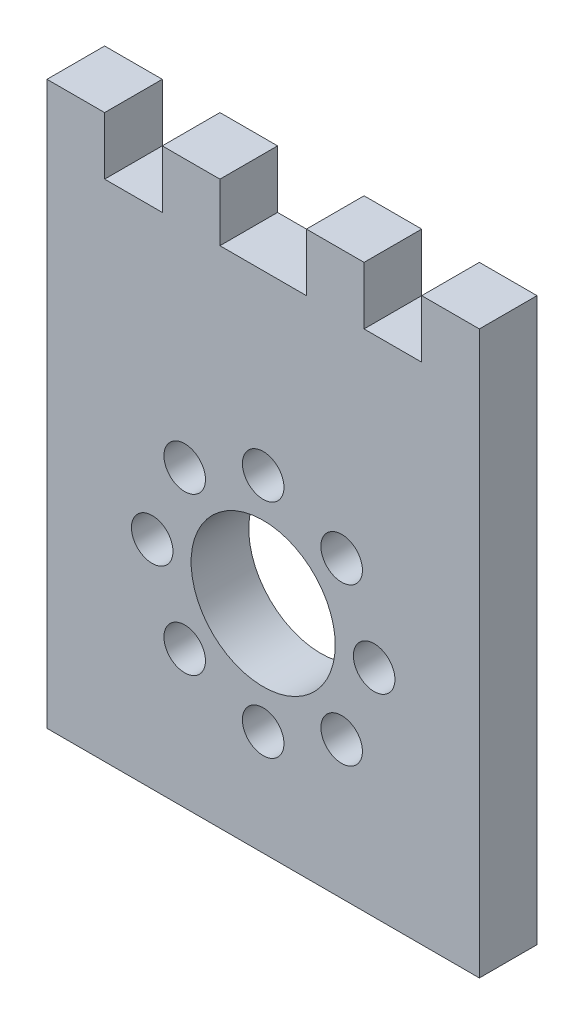
ISO-10303-21;
HEADER;
FILE_DESCRIPTION(('STEP AP214'),'2;1');
FILE_NAME('part.step','',(''),(''),'','','');
FILE_SCHEMA(('AUTOMOTIVE_DESIGN { 1 0 10303 214 1 1 1 1 }'));
ENDSEC;
DATA;
#1=APPLICATION_CONTEXT('core data for automotive mechanical design processes');
#2=APPLICATION_PROTOCOL_DEFINITION('international standard','automotive_design',2000,#1);
#3=PRODUCT_CONTEXT('',#1,'mechanical');
#4=PRODUCT('Part','Part','',(#3));
#5=PRODUCT_RELATED_PRODUCT_CATEGORY('part','',(#4));
#6=PRODUCT_DEFINITION_FORMATION('','',#4);
#7=PRODUCT_DEFINITION_CONTEXT('part definition',#1,'design');
#8=PRODUCT_DEFINITION('design','',#6,#7);
#9=PRODUCT_DEFINITION_SHAPE('','',#8);
#10=(LENGTH_UNIT() NAMED_UNIT(*) SI_UNIT(.MILLI.,.METRE.));
#11=(NAMED_UNIT(*) PLANE_ANGLE_UNIT() SI_UNIT($,.RADIAN.));
#12=(NAMED_UNIT(*) SI_UNIT($,.STERADIAN.) SOLID_ANGLE_UNIT());
#13=UNCERTAINTY_MEASURE_WITH_UNIT(LENGTH_MEASURE(1.E-05),#10,'distance_accuracy_value','');
#14=(GEOMETRIC_REPRESENTATION_CONTEXT(3) GLOBAL_UNCERTAINTY_ASSIGNED_CONTEXT((#13)) GLOBAL_UNIT_ASSIGNED_CONTEXT((#10,
#11,#12)) REPRESENTATION_CONTEXT('',''));
#15=CARTESIAN_POINT('',(0.,0.,0.));
#16=DIRECTION('',(0.,0.,1.));
#17=DIRECTION('',(1.,0.,0.));
#18=AXIS2_PLACEMENT_3D('',#15,#16,#17);
#19=CARTESIAN_POINT('',(-16.5553571428571,15.7616071428571,5.08));
#20=DIRECTION('',(1.,0.,0.));
#21=DIRECTION('',(0.,1.,0.));
#22=AXIS2_PLACEMENT_3D('',#19,#20,#21);
#23=PLANE('',#22);
#24=DIRECTION('',(0.,0.,-1.));
#25=VECTOR('',#24,1.);
#26=CARTESIAN_POINT('',(-16.5553571428571,-28.6883928571429,5.08));
#27=LINE('',#26,#25);
#28=CARTESIAN_POINT('',(-16.5553571428571,-28.6883928571429,5.08));
#29=VERTEX_POINT('',#28);
#30=CARTESIAN_POINT('',(-16.5553571428571,-28.6883928571429,0.));
#31=VERTEX_POINT('',#30);
#32=EDGE_CURVE('E50',#29,#31,#27,.T.);
#33=ORIENTED_EDGE('',*,*,#32,.F.);
#34=DIRECTION('',(0.,-1.,0.));
#35=VECTOR('',#34,1.);
#36=CARTESIAN_POINT('',(-16.5553571428571,15.7616071428571,5.08));
#37=LINE('',#36,#35);
#38=CARTESIAN_POINT('',(-16.5553571428571,20.8416071428572,5.08));
#39=VERTEX_POINT('',#38);
#40=EDGE_CURVE('E174',#39,#29,#37,.T.);
#41=ORIENTED_EDGE('',*,*,#40,.F.);
#42=DIRECTION('',(0.,0.,1.));
#43=VECTOR('',#42,1.);
#44=CARTESIAN_POINT('',(-16.5553571428571,20.8416071428572,0.));
#45=LINE('',#44,#43);
#46=CARTESIAN_POINT('',(-16.5553571428571,20.8416071428572,0.));
#47=VERTEX_POINT('',#46);
#48=EDGE_CURVE('E270',#47,#39,#45,.T.);
#49=ORIENTED_EDGE('',*,*,#48,.F.);
#50=DIRECTION('',(0.,-1.,0.));
#51=VECTOR('',#50,1.);
#52=CARTESIAN_POINT('',(-16.5553571428571,15.7616071428571,0.));
#53=LINE('',#52,#51);
#54=EDGE_CURVE('E168',#47,#31,#53,.T.);
#55=ORIENTED_EDGE('',*,*,#54,.T.);
#56=EDGE_LOOP('',(#33,#41,#49,#55));
#57=FACE_BOUND('',#56,.T.);
#58=ADVANCED_FACE('F33',(#57),#23,.F.);
#59=CARTESIAN_POINT('',(21.5446428571429,15.7616071428571,5.08));
#60=DIRECTION('',(-1.,0.,0.));
#61=DIRECTION('',(0.,0.,1.));
#62=AXIS2_PLACEMENT_3D('',#59,#60,#61);
#63=PLANE('',#62);
#64=DIRECTION('',(0.,0.,1.));
#65=VECTOR('',#64,1.);
#66=CARTESIAN_POINT('',(21.5446428571429,-28.6883928571429,5.08));
#67=LINE('',#66,#65);
#68=CARTESIAN_POINT('',(21.5446428571429,-28.6883928571429,0.));
#69=VERTEX_POINT('',#68);
#70=CARTESIAN_POINT('',(21.5446428571429,-28.6883928571429,5.08));
#71=VERTEX_POINT('',#70);
#72=EDGE_CURVE('E147',#69,#71,#67,.T.);
#73=ORIENTED_EDGE('',*,*,#72,.F.);
#74=DIRECTION('',(0.,1.,0.));
#75=VECTOR('',#74,1.);
#76=CARTESIAN_POINT('',(21.5446428571429,15.7616071428571,0.));
#77=LINE('',#76,#75);
#78=CARTESIAN_POINT('',(21.5446428571429,20.8416071428572,0.));
#79=VERTEX_POINT('',#78);
#80=EDGE_CURVE('E157',#69,#79,#77,.T.);
#81=ORIENTED_EDGE('',*,*,#80,.T.);
#82=DIRECTION('',(0.,0.,1.));
#83=VECTOR('',#82,1.);
#84=CARTESIAN_POINT('',(21.5446428571429,20.8416071428572,0.));
#85=LINE('',#84,#83);
#86=CARTESIAN_POINT('',(21.5446428571429,20.8416071428572,5.08));
#87=VERTEX_POINT('',#86);
#88=EDGE_CURVE('E260',#79,#87,#85,.T.);
#89=ORIENTED_EDGE('',*,*,#88,.T.);
#90=DIRECTION('',(0.,1.,0.));
#91=VECTOR('',#90,1.);
#92=CARTESIAN_POINT('',(21.5446428571429,15.7616071428571,5.08));
#93=LINE('',#92,#91);
#94=EDGE_CURVE('E159',#71,#87,#93,.T.);
#95=ORIENTED_EDGE('',*,*,#94,.F.);
#96=EDGE_LOOP('',(#73,#81,#89,#95));
#97=FACE_BOUND('',#96,.T.);
#98=ADVANCED_FACE('F155',(#97),#63,.F.);
#99=CARTESIAN_POINT('',(0.,0.,5.08));
#100=DIRECTION('',(0.,0.,1.));
#101=DIRECTION('',(1.,0.,0.));
#102=AXIS2_PLACEMENT_3D('',#99,#100,#101);
#103=PLANE('',#102);
#104=CARTESIAN_POINT('',(9.4094400703662,-2.72359564391969,5.08));
#105=DIRECTION('',(0.,0.,1.));
#106=DIRECTION('',(1.,0.,0.));
#107=AXIS2_PLACEMENT_3D('',#104,#105,#106);
#108=CIRCLE('',#107,1.8288);
#109=CARTESIAN_POINT('',(11.2382400703662,-2.72359564391969,5.08));
#110=VERTEX_POINT('',#109);
#111=EDGE_CURVE('E207',#110,#110,#108,.T.);
#112=ORIENTED_EDGE('',*,*,#111,.F.);
#113=EDGE_LOOP('',(#112));
#114=FACE_BOUND('',#113,.T.);
#115=CARTESIAN_POINT('',(2.49464285714297,0.140607142857147,5.08));
#116=DIRECTION('',(0.,0.,1.));
#117=DIRECTION('',(1.,0.,0.));
#118=AXIS2_PLACEMENT_3D('',#115,#116,#117);
#119=CIRCLE('',#118,1.8288);
#120=CARTESIAN_POINT('',(4.32344285714297,0.140607142857147,5.08));
#121=VERTEX_POINT('',#120);
#122=EDGE_CURVE('E214',#121,#121,#119,.T.);
#123=ORIENTED_EDGE('',*,*,#122,.F.);
#124=EDGE_LOOP('',(#123));
#125=FACE_BOUND('',#124,.T.);
#126=CARTESIAN_POINT('',(-4.42015435608032,-2.72359564391954,5.08));
#127=DIRECTION('',(0.,0.,1.));
#128=DIRECTION('',(1.,0.,0.));
#129=AXIS2_PLACEMENT_3D('',#126,#127,#128);
#130=CIRCLE('',#129,1.8288);
#131=CARTESIAN_POINT('',(-2.59135435608032,-2.72359564391954,5.08));
#132=VERTEX_POINT('',#131);
#133=EDGE_CURVE('E220',#132,#132,#130,.T.);
#134=ORIENTED_EDGE('',*,*,#133,.F.);
#135=EDGE_LOOP('',(#134));
#136=FACE_BOUND('',#135,.T.);
#137=CARTESIAN_POINT('',(-7.28435714285713,-9.63839285714278,5.08));
#138=DIRECTION('',(0.,0.,1.));
#139=DIRECTION('',(1.,0.,0.));
#140=AXIS2_PLACEMENT_3D('',#137,#138,#139);
#141=CIRCLE('',#140,1.8288);
#142=CARTESIAN_POINT('',(-5.45555714285713,-9.63839285714278,5.08));
#143=VERTEX_POINT('',#142);
#144=EDGE_CURVE('E226',#143,#143,#141,.T.);
#145=ORIENTED_EDGE('',*,*,#144,.F.);
#146=EDGE_LOOP('',(#145));
#147=FACE_BOUND('',#146,.T.);
#148=CARTESIAN_POINT('',(-4.42015435608041,-16.5531900703661,5.08));
#149=DIRECTION('',(0.,0.,1.));
#150=DIRECTION('',(1.,0.,0.));
#151=AXIS2_PLACEMENT_3D('',#148,#149,#150);
#152=CIRCLE('',#151,1.8288);
#153=CARTESIAN_POINT('',(-2.59135435608041,-16.5531900703661,5.08));
#154=VERTEX_POINT('',#153);
#155=EDGE_CURVE('E183',#154,#154,#152,.T.);
#156=ORIENTED_EDGE('',*,*,#155,.F.);
#157=EDGE_LOOP('',(#156));
#158=FACE_BOUND('',#157,.T.);
#159=CARTESIAN_POINT('',(2.49464285714284,-19.4173928571428,5.08));
#160=DIRECTION('',(0.,0.,1.));
#161=DIRECTION('',(1.,0.,0.));
#162=AXIS2_PLACEMENT_3D('',#159,#160,#161);
#163=CIRCLE('',#162,1.8288);
#164=CARTESIAN_POINT('',(4.32344285714284,-19.4173928571428,5.08));
#165=VERTEX_POINT('',#164);
#166=EDGE_CURVE('E190',#165,#165,#163,.T.);
#167=ORIENTED_EDGE('',*,*,#166,.F.);
#168=EDGE_LOOP('',(#167));
#169=FACE_BOUND('',#168,.T.);
#170=CARTESIAN_POINT('',(9.40944007036611,-16.5531900703661,5.08));
#171=DIRECTION('',(0.,0.,1.));
#172=DIRECTION('',(1.,0.,0.));
#173=AXIS2_PLACEMENT_3D('',#170,#171,#172);
#174=CIRCLE('',#173,1.8288);
#175=CARTESIAN_POINT('',(11.2382400703661,-16.5531900703661,5.08));
#176=VERTEX_POINT('',#175);
#177=EDGE_CURVE('E196',#176,#176,#174,.T.);
#178=ORIENTED_EDGE('',*,*,#177,.F.);
#179=EDGE_LOOP('',(#178));
#180=FACE_BOUND('',#179,.T.);
#181=CARTESIAN_POINT('',(12.2736428571429,-9.63839285714285,5.08));
#182=DIRECTION('',(0.,0.,1.));
#183=DIRECTION('',(1.,0.,0.));
#184=AXIS2_PLACEMENT_3D('',#181,#182,#183);
#185=CIRCLE('',#184,1.8288);
#186=CARTESIAN_POINT('',(14.1024428571429,-9.63839285714285,5.08));
#187=VERTEX_POINT('',#186);
#188=EDGE_CURVE('E202',#187,#187,#185,.T.);
#189=ORIENTED_EDGE('',*,*,#188,.F.);
#190=EDGE_LOOP('',(#189));
#191=FACE_BOUND('',#190,.T.);
#192=CARTESIAN_POINT('',(2.49464285714287,-9.63839285714285,5.08));
#193=DIRECTION('',(0.,0.,1.));
#194=DIRECTION('',(1.,0.,0.));
#195=AXIS2_PLACEMENT_3D('',#192,#193,#194);
#196=CIRCLE('',#195,6.35);
#197=CARTESIAN_POINT('',(8.84464285714287,-9.63839285714285,5.08));
#198=VERTEX_POINT('',#197);
#199=EDGE_CURVE('E177',#198,#198,#196,.T.);
#200=ORIENTED_EDGE('',*,*,#199,.F.);
#201=EDGE_LOOP('',(#200));
#202=FACE_BOUND('',#201,.T.);
#203=ORIENTED_EDGE('',*,*,#40,.T.);
#204=DIRECTION('',(-1.,0.,0.));
#205=VECTOR('',#204,1.);
#206=CARTESIAN_POINT('',(-16.5553571428571,-28.6883928571429,5.08));
#207=LINE('',#206,#205);
#208=EDGE_CURVE('E160',#71,#29,#207,.T.);
#209=ORIENTED_EDGE('',*,*,#208,.F.);
#210=ORIENTED_EDGE('',*,*,#94,.T.);
#211=DIRECTION('',(-1.,0.,0.));
#212=VECTOR('',#211,1.);
#213=CARTESIAN_POINT('',(16.4646428571429,20.8416071428572,5.08));
#214=LINE('',#213,#212);
#215=CARTESIAN_POINT('',(16.4646428571429,20.8416071428572,5.08));
#216=VERTEX_POINT('',#215);
#217=EDGE_CURVE('E263',#87,#216,#214,.T.);
#218=ORIENTED_EDGE('',*,*,#217,.T.);
#219=DIRECTION('',(0.,-1.,0.));
#220=VECTOR('',#219,1.);
#221=CARTESIAN_POINT('',(16.4646428571429,15.7616071428572,5.08));
#222=LINE('',#221,#220);
#223=CARTESIAN_POINT('',(16.4646428571429,15.7616071428571,5.08));
#224=VERTEX_POINT('',#223);
#225=EDGE_CURVE('E267',#216,#224,#222,.T.);
#226=ORIENTED_EDGE('',*,*,#225,.T.);
#227=DIRECTION('',(-1.,0.,0.));
#228=VECTOR('',#227,1.);
#229=CARTESIAN_POINT('',(-16.5553571428571,15.7616071428571,5.08));
#230=LINE('',#229,#228);
#231=CARTESIAN_POINT('',(11.3846428571429,15.7616071428571,5.08));
#232=VERTEX_POINT('',#231);
#233=EDGE_CURVE('E11',#224,#232,#230,.T.);
#234=ORIENTED_EDGE('',*,*,#233,.T.);
#235=DIRECTION('',(0.,1.,0.));
#236=VECTOR('',#235,1.);
#237=CARTESIAN_POINT('',(11.3846428571429,15.7616071428571,5.08));
#238=LINE('',#237,#236);
#239=CARTESIAN_POINT('',(11.3846428571429,20.8416071428571,5.08));
#240=VERTEX_POINT('',#239);
#241=EDGE_CURVE('E244',#232,#240,#238,.T.);
#242=ORIENTED_EDGE('',*,*,#241,.T.);
#243=DIRECTION('',(-1.,0.,0.));
#244=VECTOR('',#243,1.);
#245=CARTESIAN_POINT('',(6.30464285714286,20.8416071428571,5.08));
#246=LINE('',#245,#244);
#247=CARTESIAN_POINT('',(6.30464285714286,20.8416071428571,5.08));
#248=VERTEX_POINT('',#247);
#249=EDGE_CURVE('E240',#240,#248,#246,.T.);
#250=ORIENTED_EDGE('',*,*,#249,.T.);
#251=DIRECTION('',(0.,-1.,0.));
#252=VECTOR('',#251,1.);
#253=CARTESIAN_POINT('',(6.30464285714286,15.7616071428571,5.08));
#254=LINE('',#253,#252);
#255=CARTESIAN_POINT('',(6.30464285714286,15.7616071428571,5.08));
#256=VERTEX_POINT('',#255);
#257=EDGE_CURVE('E247',#248,#256,#254,.T.);
#258=ORIENTED_EDGE('',*,*,#257,.T.);
#259=CARTESIAN_POINT('',(-1.31535714285712,15.7616071428571,5.08));
#260=VERTEX_POINT('',#259);
#261=EDGE_CURVE('E41',#256,#260,#230,.T.);
#262=ORIENTED_EDGE('',*,*,#261,.T.);
#263=DIRECTION('',(0.,1.,0.));
#264=VECTOR('',#263,1.);
#265=CARTESIAN_POINT('',(-1.31535714285712,15.7616071428571,5.08));
#266=LINE('',#265,#264);
#267=CARTESIAN_POINT('',(-1.31535714285712,20.8416071428571,5.08));
#268=VERTEX_POINT('',#267);
#269=EDGE_CURVE('E308',#260,#268,#266,.T.);
#270=ORIENTED_EDGE('',*,*,#269,.T.);
#271=DIRECTION('',(-1.,0.,0.));
#272=VECTOR('',#271,1.);
#273=CARTESIAN_POINT('',(-1.31535714285712,20.8416071428571,5.08));
#274=LINE('',#273,#272);
#275=CARTESIAN_POINT('',(-6.39535714285712,20.8416071428571,5.08));
#276=VERTEX_POINT('',#275);
#277=EDGE_CURVE('E305',#268,#276,#274,.T.);
#278=ORIENTED_EDGE('',*,*,#277,.T.);
#279=DIRECTION('',(0.,-1.,0.));
#280=VECTOR('',#279,1.);
#281=CARTESIAN_POINT('',(-6.39535714285712,15.7616071428571,5.08));
#282=LINE('',#281,#280);
#283=CARTESIAN_POINT('',(-6.39535714285712,15.7616071428571,5.08));
#284=VERTEX_POINT('',#283);
#285=EDGE_CURVE('E301',#276,#284,#282,.T.);
#286=ORIENTED_EDGE('',*,*,#285,.T.);
#287=CARTESIAN_POINT('',(-11.4753571428571,15.7616071428571,5.08));
#288=VERTEX_POINT('',#287);
#289=EDGE_CURVE('E43',#284,#288,#230,.T.);
#290=ORIENTED_EDGE('',*,*,#289,.T.);
#291=DIRECTION('',(0.,1.,0.));
#292=VECTOR('',#291,1.);
#293=CARTESIAN_POINT('',(-11.4753571428571,15.7616071428572,5.08));
#294=LINE('',#293,#292);
#295=CARTESIAN_POINT('',(-11.4753571428571,20.8416071428572,5.08));
#296=VERTEX_POINT('',#295);
#297=EDGE_CURVE('E285',#288,#296,#294,.T.);
#298=ORIENTED_EDGE('',*,*,#297,.T.);
#299=DIRECTION('',(-1.,0.,0.));
#300=VECTOR('',#299,1.);
#301=CARTESIAN_POINT('',(-11.4753571428571,20.8416071428572,5.08));
#302=LINE('',#301,#300);
#303=EDGE_CURVE('E281',#296,#39,#302,.T.);
#304=ORIENTED_EDGE('',*,*,#303,.T.);
#305=EDGE_LOOP('',(#203,#209,#210,#218,#226,#234,#242,#250,#258,#262,#270,#278,#286,#290,#298,#304));
#306=FACE_BOUND('',#305,.T.);
#307=ADVANCED_FACE('F322',(#114,#125,#136,#147,#158,#169,#180,#191,#202,#306),#103,.T.);
#308=CARTESIAN_POINT('',(0.,0.,0.));
#309=DIRECTION('',(0.,0.,1.));
#310=DIRECTION('',(1.,0.,0.));
#311=AXIS2_PLACEMENT_3D('',#308,#309,#310);
#312=PLANE('',#311);
#313=CARTESIAN_POINT('',(2.49464285714287,-9.63839285714285,0.));
#314=DIRECTION('',(0.,0.,1.));
#315=DIRECTION('',(1.,0.,0.));
#316=AXIS2_PLACEMENT_3D('',#313,#314,#315);
#317=CIRCLE('',#316,6.35);
#318=CARTESIAN_POINT('',(8.84464285714287,-9.63839285714285,0.));
#319=VERTEX_POINT('',#318);
#320=EDGE_CURVE('E170',#319,#319,#317,.T.);
#321=ORIENTED_EDGE('',*,*,#320,.T.);
#322=EDGE_LOOP('',(#321));
#323=FACE_BOUND('',#322,.T.);
#324=CARTESIAN_POINT('',(12.2736428571429,-9.63839285714285,0.));
#325=DIRECTION('',(0.,0.,1.));
#326=DIRECTION('',(1.,0.,0.));
#327=AXIS2_PLACEMENT_3D('',#324,#325,#326);
#328=CIRCLE('',#327,1.8288);
#329=CARTESIAN_POINT('',(14.1024428571429,-9.63839285714285,0.));
#330=VERTEX_POINT('',#329);
#331=EDGE_CURVE('E180',#330,#330,#328,.T.);
#332=ORIENTED_EDGE('',*,*,#331,.T.);
#333=EDGE_LOOP('',(#332));
#334=FACE_BOUND('',#333,.T.);
#335=CARTESIAN_POINT('',(9.40944007036611,-16.5531900703661,0.));
#336=DIRECTION('',(0.,0.,1.));
#337=DIRECTION('',(1.,0.,0.));
#338=AXIS2_PLACEMENT_3D('',#335,#336,#337);
#339=CIRCLE('',#338,1.8288);
#340=CARTESIAN_POINT('',(11.2382400703661,-16.5531900703661,0.));
#341=VERTEX_POINT('',#340);
#342=EDGE_CURVE('E199',#341,#341,#339,.T.);
#343=ORIENTED_EDGE('',*,*,#342,.T.);
#344=EDGE_LOOP('',(#343));
#345=FACE_BOUND('',#344,.T.);
#346=CARTESIAN_POINT('',(2.49464285714284,-19.4173928571428,0.));
#347=DIRECTION('',(0.,0.,1.));
#348=DIRECTION('',(1.,0.,0.));
#349=AXIS2_PLACEMENT_3D('',#346,#347,#348);
#350=CIRCLE('',#349,1.8288);
#351=CARTESIAN_POINT('',(4.32344285714284,-19.4173928571428,0.));
#352=VERTEX_POINT('',#351);
#353=EDGE_CURVE('E193',#352,#352,#350,.T.);
#354=ORIENTED_EDGE('',*,*,#353,.T.);
#355=EDGE_LOOP('',(#354));
#356=FACE_BOUND('',#355,.T.);
#357=CARTESIAN_POINT('',(-4.42015435608041,-16.5531900703661,0.));
#358=DIRECTION('',(0.,0.,1.));
#359=DIRECTION('',(1.,0.,0.));
#360=AXIS2_PLACEMENT_3D('',#357,#358,#359);
#361=CIRCLE('',#360,1.8288);
#362=CARTESIAN_POINT('',(-2.59135435608041,-16.5531900703661,0.));
#363=VERTEX_POINT('',#362);
#364=EDGE_CURVE('E186',#363,#363,#361,.T.);
#365=ORIENTED_EDGE('',*,*,#364,.T.);
#366=EDGE_LOOP('',(#365));
#367=FACE_BOUND('',#366,.T.);
#368=CARTESIAN_POINT('',(-7.28435714285713,-9.63839285714278,0.));
#369=DIRECTION('',(0.,0.,1.));
#370=DIRECTION('',(1.,0.,0.));
#371=AXIS2_PLACEMENT_3D('',#368,#369,#370);
#372=CIRCLE('',#371,1.8288);
#373=CARTESIAN_POINT('',(-5.45555714285713,-9.63839285714278,0.));
#374=VERTEX_POINT('',#373);
#375=EDGE_CURVE('E187',#374,#374,#372,.T.);
#376=ORIENTED_EDGE('',*,*,#375,.T.);
#377=EDGE_LOOP('',(#376));
#378=FACE_BOUND('',#377,.T.);
#379=CARTESIAN_POINT('',(-4.42015435608032,-2.72359564391954,0.));
#380=DIRECTION('',(0.,0.,1.));
#381=DIRECTION('',(1.,0.,0.));
#382=AXIS2_PLACEMENT_3D('',#379,#380,#381);
#383=CIRCLE('',#382,1.8288);
#384=CARTESIAN_POINT('',(-2.59135435608032,-2.72359564391954,0.));
#385=VERTEX_POINT('',#384);
#386=EDGE_CURVE('E223',#385,#385,#383,.T.);
#387=ORIENTED_EDGE('',*,*,#386,.T.);
#388=EDGE_LOOP('',(#387));
#389=FACE_BOUND('',#388,.T.);
#390=CARTESIAN_POINT('',(2.49464285714297,0.140607142857147,0.));
#391=DIRECTION('',(0.,0.,1.));
#392=DIRECTION('',(1.,0.,0.));
#393=AXIS2_PLACEMENT_3D('',#390,#391,#392);
#394=CIRCLE('',#393,1.8288);
#395=CARTESIAN_POINT('',(4.32344285714297,0.140607142857147,0.));
#396=VERTEX_POINT('',#395);
#397=EDGE_CURVE('E217',#396,#396,#394,.T.);
#398=ORIENTED_EDGE('',*,*,#397,.T.);
#399=EDGE_LOOP('',(#398));
#400=FACE_BOUND('',#399,.T.);
#401=CARTESIAN_POINT('',(9.4094400703662,-2.72359564391969,0.));
#402=DIRECTION('',(0.,0.,1.));
#403=DIRECTION('',(1.,0.,0.));
#404=AXIS2_PLACEMENT_3D('',#401,#402,#403);
#405=CIRCLE('',#404,1.8288);
#406=CARTESIAN_POINT('',(11.2382400703662,-2.72359564391969,0.));
#407=VERTEX_POINT('',#406);
#408=EDGE_CURVE('E210',#407,#407,#405,.T.);
#409=ORIENTED_EDGE('',*,*,#408,.T.);
#410=EDGE_LOOP('',(#409));
#411=FACE_BOUND('',#410,.T.);
#412=DIRECTION('',(1.,0.,0.));
#413=VECTOR('',#412,1.);
#414=CARTESIAN_POINT('',(-16.5553571428571,-28.6883928571429,0.));
#415=LINE('',#414,#413);
#416=EDGE_CURVE('E144',#31,#69,#415,.T.);
#417=ORIENTED_EDGE('',*,*,#416,.F.);
#418=ORIENTED_EDGE('',*,*,#54,.F.);
#419=DIRECTION('',(-1.,0.,0.));
#420=VECTOR('',#419,1.);
#421=CARTESIAN_POINT('',(-11.4753571428571,20.8416071428572,0.));
#422=LINE('',#421,#420);
#423=CARTESIAN_POINT('',(-11.4753571428571,20.8416071428572,0.));
#424=VERTEX_POINT('',#423);
#425=EDGE_CURVE('E277',#424,#47,#422,.T.);
#426=ORIENTED_EDGE('',*,*,#425,.F.);
#427=DIRECTION('',(0.,1.,0.));
#428=VECTOR('',#427,1.);
#429=CARTESIAN_POINT('',(-11.4753571428571,15.7616071428572,0.));
#430=LINE('',#429,#428);
#431=CARTESIAN_POINT('',(-11.4753571428571,15.7616071428571,0.));
#432=VERTEX_POINT('',#431);
#433=EDGE_CURVE('E284',#432,#424,#430,.T.);
#434=ORIENTED_EDGE('',*,*,#433,.F.);
#435=DIRECTION('',(-1.,0.,0.));
#436=VECTOR('',#435,1.);
#437=CARTESIAN_POINT('',(-16.5553571428571,15.7616071428571,0.));
#438=LINE('',#437,#436);
#439=CARTESIAN_POINT('',(-6.39535714285712,15.7616071428571,0.));
#440=VERTEX_POINT('',#439);
#441=EDGE_CURVE('E167',#440,#432,#438,.T.);
#442=ORIENTED_EDGE('',*,*,#441,.F.);
#443=DIRECTION('',(0.,-1.,0.));
#444=VECTOR('',#443,1.);
#445=CARTESIAN_POINT('',(-6.39535714285712,15.7616071428571,0.));
#446=LINE('',#445,#444);
#447=CARTESIAN_POINT('',(-6.39535714285712,20.8416071428571,0.));
#448=VERTEX_POINT('',#447);
#449=EDGE_CURVE('E296',#448,#440,#446,.T.);
#450=ORIENTED_EDGE('',*,*,#449,.F.);
#451=DIRECTION('',(-1.,0.,0.));
#452=VECTOR('',#451,1.);
#453=CARTESIAN_POINT('',(-1.31535714285712,20.8416071428571,0.));
#454=LINE('',#453,#452);
#455=CARTESIAN_POINT('',(-1.31535714285712,20.8416071428571,0.));
#456=VERTEX_POINT('',#455);
#457=EDGE_CURVE('E313',#456,#448,#454,.T.);
#458=ORIENTED_EDGE('',*,*,#457,.F.);
#459=DIRECTION('',(0.,1.,0.));
#460=VECTOR('',#459,1.);
#461=CARTESIAN_POINT('',(-1.31535714285712,15.7616071428571,0.));
#462=LINE('',#461,#460);
#463=CARTESIAN_POINT('',(-1.31535714285712,15.7616071428571,0.));
#464=VERTEX_POINT('',#463);
#465=EDGE_CURVE('E304',#464,#456,#462,.T.);
#466=ORIENTED_EDGE('',*,*,#465,.F.);
#467=CARTESIAN_POINT('',(6.30464285714286,15.7616071428571,0.));
#468=VERTEX_POINT('',#467);
#469=EDGE_CURVE('E169',#468,#464,#438,.T.);
#470=ORIENTED_EDGE('',*,*,#469,.F.);
#471=DIRECTION('',(0.,-1.,0.));
#472=VECTOR('',#471,1.);
#473=CARTESIAN_POINT('',(6.30464285714286,15.7616071428571,0.));
#474=LINE('',#473,#472);
#475=CARTESIAN_POINT('',(6.30464285714286,20.8416071428571,0.));
#476=VERTEX_POINT('',#475);
#477=EDGE_CURVE('E243',#476,#468,#474,.T.);
#478=ORIENTED_EDGE('',*,*,#477,.F.);
#479=DIRECTION('',(-1.,0.,0.));
#480=VECTOR('',#479,1.);
#481=CARTESIAN_POINT('',(6.30464285714286,20.8416071428571,0.));
#482=LINE('',#481,#480);
#483=CARTESIAN_POINT('',(11.3846428571429,20.8416071428571,0.));
#484=VERTEX_POINT('',#483);
#485=EDGE_CURVE('E234',#484,#476,#482,.T.);
#486=ORIENTED_EDGE('',*,*,#485,.F.);
#487=DIRECTION('',(0.,1.,0.));
#488=VECTOR('',#487,1.);
#489=CARTESIAN_POINT('',(11.3846428571429,15.7616071428571,0.));
#490=LINE('',#489,#488);
#491=CARTESIAN_POINT('',(11.3846428571429,15.7616071428571,0.));
#492=VERTEX_POINT('',#491);
#493=EDGE_CURVE('E253',#492,#484,#490,.T.);
#494=ORIENTED_EDGE('',*,*,#493,.F.);
#495=CARTESIAN_POINT('',(16.4646428571429,15.7616071428572,0.));
#496=VERTEX_POINT('',#495);
#497=EDGE_CURVE('E36',#496,#492,#438,.T.);
#498=ORIENTED_EDGE('',*,*,#497,.F.);
#499=DIRECTION('',(0.,-1.,0.));
#500=VECTOR('',#499,1.);
#501=CARTESIAN_POINT('',(16.4646428571429,15.7616071428572,0.));
#502=LINE('',#501,#500);
#503=CARTESIAN_POINT('',(16.4646428571429,20.8416071428572,0.));
#504=VERTEX_POINT('',#503);
#505=EDGE_CURVE('E266',#504,#496,#502,.T.);
#506=ORIENTED_EDGE('',*,*,#505,.F.);
#507=DIRECTION('',(-1.,0.,0.));
#508=VECTOR('',#507,1.);
#509=CARTESIAN_POINT('',(16.4646428571429,20.8416071428572,0.));
#510=LINE('',#509,#508);
#511=EDGE_CURVE('E166',#79,#504,#510,.T.);
#512=ORIENTED_EDGE('',*,*,#511,.F.);
#513=ORIENTED_EDGE('',*,*,#80,.F.);
#514=EDGE_LOOP('',(#417,#418,#426,#434,#442,#450,#458,#466,#470,#478,#486,#494,#498,#506,#512,#513));
#515=FACE_BOUND('',#514,.T.);
#516=ADVANCED_FACE('F163',(#323,#334,#345,#356,#367,#378,#389,#400,#411,#515),#312,.F.);
#517=CARTESIAN_POINT('',(-16.5553571428571,15.7616071428571,5.08));
#518=DIRECTION('',(0.,-1.,0.));
#519=DIRECTION('',(0.,0.,-1.));
#520=AXIS2_PLACEMENT_3D('',#517,#518,#519);
#521=PLANE('',#520);
#522=ORIENTED_EDGE('',*,*,#289,.F.);
#523=DIRECTION('',(0.,0.,1.));
#524=VECTOR('',#523,1.);
#525=CARTESIAN_POINT('',(-6.39535714285712,15.7616071428571,0.));
#526=LINE('',#525,#524);
#527=EDGE_CURVE('E288',#440,#284,#526,.T.);
#528=ORIENTED_EDGE('',*,*,#527,.F.);
#529=ORIENTED_EDGE('',*,*,#441,.T.);
#530=DIRECTION('',(0.,0.,1.));
#531=VECTOR('',#530,1.);
#532=CARTESIAN_POINT('',(-11.4753571428571,15.7616071428572,0.));
#533=LINE('',#532,#531);
#534=EDGE_CURVE('E274',#432,#288,#533,.T.);
#535=ORIENTED_EDGE('',*,*,#534,.T.);
#536=EDGE_LOOP('',(#522,#528,#529,#535));
#537=FACE_BOUND('',#536,.T.);
#538=ADVANCED_FACE('F332',(#537),#521,.F.);
#539=ORIENTED_EDGE('',*,*,#469,.T.);
#540=DIRECTION('',(0.,0.,1.));
#541=VECTOR('',#540,1.);
#542=CARTESIAN_POINT('',(-1.31535714285712,15.7616071428571,0.));
#543=LINE('',#542,#541);
#544=EDGE_CURVE('E293',#464,#260,#543,.T.);
#545=ORIENTED_EDGE('',*,*,#544,.T.);
#546=ORIENTED_EDGE('',*,*,#261,.F.);
#547=DIRECTION('',(0.,0.,1.));
#548=VECTOR('',#547,1.);
#549=CARTESIAN_POINT('',(6.30464285714286,15.7616071428571,0.));
#550=LINE('',#549,#548);
#551=EDGE_CURVE('E231',#468,#256,#550,.T.);
#552=ORIENTED_EDGE('',*,*,#551,.F.);
#553=EDGE_LOOP('',(#539,#545,#546,#552));
#554=FACE_BOUND('',#553,.T.);
#555=ADVANCED_FACE('F391',(#554),#521,.F.);
#556=ORIENTED_EDGE('',*,*,#233,.F.);
#557=DIRECTION('',(0.,0.,1.));
#558=VECTOR('',#557,1.);
#559=CARTESIAN_POINT('',(16.4646428571429,15.7616071428572,0.));
#560=LINE('',#559,#558);
#561=EDGE_CURVE('E257',#496,#224,#560,.T.);
#562=ORIENTED_EDGE('',*,*,#561,.F.);
#563=ORIENTED_EDGE('',*,*,#497,.T.);
#564=DIRECTION('',(0.,0.,1.));
#565=VECTOR('',#564,1.);
#566=CARTESIAN_POINT('',(11.3846428571429,15.7616071428571,0.));
#567=LINE('',#566,#565);
#568=EDGE_CURVE('E233',#492,#232,#567,.T.);
#569=ORIENTED_EDGE('',*,*,#568,.T.);
#570=EDGE_LOOP('',(#556,#562,#563,#569));
#571=FACE_BOUND('',#570,.T.);
#572=ADVANCED_FACE('F354',(#571),#521,.F.);
#573=CARTESIAN_POINT('',(2.49464285714287,-9.63839285714285,0.));
#574=DIRECTION('',(0.,0.,1.));
#575=DIRECTION('',(1.,0.,0.));
#576=AXIS2_PLACEMENT_3D('',#573,#574,#575);
#577=CYLINDRICAL_SURFACE('',#576,6.35);
#578=ORIENTED_EDGE('',*,*,#320,.F.);
#579=EDGE_LOOP('',(#578));
#580=FACE_BOUND('',#579,.T.);
#581=ORIENTED_EDGE('',*,*,#199,.T.);
#582=EDGE_LOOP('',(#581));
#583=FACE_BOUND('',#582,.T.);
#584=ADVANCED_FACE('F390',(#580,#583),#577,.F.);
#585=CARTESIAN_POINT('',(12.2736428571429,-9.63839285714285,0.));
#586=DIRECTION('',(0.,0.,1.));
#587=DIRECTION('',(1.,0.,0.));
#588=AXIS2_PLACEMENT_3D('',#585,#586,#587);
#589=CYLINDRICAL_SURFACE('',#588,1.8288);
#590=ORIENTED_EDGE('',*,*,#331,.F.);
#591=EDGE_LOOP('',(#590));
#592=FACE_BOUND('',#591,.T.);
#593=ORIENTED_EDGE('',*,*,#188,.T.);
#594=EDGE_LOOP('',(#593));
#595=FACE_BOUND('',#594,.T.);
#596=ADVANCED_FACE('F397',(#592,#595),#589,.F.);
#597=CARTESIAN_POINT('',(9.40944007036611,-16.5531900703661,0.));
#598=DIRECTION('',(0.,0.,1.));
#599=DIRECTION('',(1.,0.,0.));
#600=AXIS2_PLACEMENT_3D('',#597,#598,#599);
#601=CYLINDRICAL_SURFACE('',#600,1.8288);
#602=ORIENTED_EDGE('',*,*,#342,.F.);
#603=EDGE_LOOP('',(#602));
#604=FACE_BOUND('',#603,.T.);
#605=ORIENTED_EDGE('',*,*,#177,.T.);
#606=EDGE_LOOP('',(#605));
#607=FACE_BOUND('',#606,.T.);
#608=ADVANCED_FACE('F407',(#604,#607),#601,.F.);
#609=CARTESIAN_POINT('',(2.49464285714284,-19.4173928571428,0.));
#610=DIRECTION('',(0.,0.,1.));
#611=DIRECTION('',(1.,0.,0.));
#612=AXIS2_PLACEMENT_3D('',#609,#610,#611);
#613=CYLINDRICAL_SURFACE('',#612,1.8288);
#614=ORIENTED_EDGE('',*,*,#353,.F.);
#615=EDGE_LOOP('',(#614));
#616=FACE_BOUND('',#615,.T.);
#617=ORIENTED_EDGE('',*,*,#166,.T.);
#618=EDGE_LOOP('',(#617));
#619=FACE_BOUND('',#618,.T.);
#620=ADVANCED_FACE('F403',(#616,#619),#613,.F.);
#621=CARTESIAN_POINT('',(-4.42015435608041,-16.5531900703661,0.));
#622=DIRECTION('',(0.,0.,1.));
#623=DIRECTION('',(1.,0.,0.));
#624=AXIS2_PLACEMENT_3D('',#621,#622,#623);
#625=CYLINDRICAL_SURFACE('',#624,1.8288);
#626=ORIENTED_EDGE('',*,*,#364,.F.);
#627=EDGE_LOOP('',(#626));
#628=FACE_BOUND('',#627,.T.);
#629=ORIENTED_EDGE('',*,*,#155,.T.);
#630=EDGE_LOOP('',(#629));
#631=FACE_BOUND('',#630,.T.);
#632=ADVANCED_FACE('F399',(#628,#631),#625,.F.);
#633=CARTESIAN_POINT('',(-7.28435714285713,-9.63839285714278,0.));
#634=DIRECTION('',(0.,0.,1.));
#635=DIRECTION('',(1.,0.,0.));
#636=AXIS2_PLACEMENT_3D('',#633,#634,#635);
#637=CYLINDRICAL_SURFACE('',#636,1.8288);
#638=ORIENTED_EDGE('',*,*,#375,.F.);
#639=EDGE_LOOP('',(#638));
#640=FACE_BOUND('',#639,.T.);
#641=ORIENTED_EDGE('',*,*,#144,.T.);
#642=EDGE_LOOP('',(#641));
#643=FACE_BOUND('',#642,.T.);
#644=ADVANCED_FACE('F402',(#640,#643),#637,.F.);
#645=CARTESIAN_POINT('',(-4.42015435608032,-2.72359564391954,0.));
#646=DIRECTION('',(0.,0.,1.));
#647=DIRECTION('',(1.,0.,0.));
#648=AXIS2_PLACEMENT_3D('',#645,#646,#647);
#649=CYLINDRICAL_SURFACE('',#648,1.8288);
#650=ORIENTED_EDGE('',*,*,#386,.F.);
#651=EDGE_LOOP('',(#650));
#652=FACE_BOUND('',#651,.T.);
#653=ORIENTED_EDGE('',*,*,#133,.T.);
#654=EDGE_LOOP('',(#653));
#655=FACE_BOUND('',#654,.T.);
#656=ADVANCED_FACE('F423',(#652,#655),#649,.F.);
#657=CARTESIAN_POINT('',(2.49464285714297,0.140607142857147,0.));
#658=DIRECTION('',(0.,0.,1.));
#659=DIRECTION('',(1.,0.,0.));
#660=AXIS2_PLACEMENT_3D('',#657,#658,#659);
#661=CYLINDRICAL_SURFACE('',#660,1.8288);
#662=ORIENTED_EDGE('',*,*,#397,.F.);
#663=EDGE_LOOP('',(#662));
#664=FACE_BOUND('',#663,.T.);
#665=ORIENTED_EDGE('',*,*,#122,.T.);
#666=EDGE_LOOP('',(#665));
#667=FACE_BOUND('',#666,.T.);
#668=ADVANCED_FACE('F419',(#664,#667),#661,.F.);
#669=CARTESIAN_POINT('',(9.4094400703662,-2.72359564391969,0.));
#670=DIRECTION('',(0.,0.,1.));
#671=DIRECTION('',(1.,0.,0.));
#672=AXIS2_PLACEMENT_3D('',#669,#670,#671);
#673=CYLINDRICAL_SURFACE('',#672,1.8288);
#674=ORIENTED_EDGE('',*,*,#408,.F.);
#675=EDGE_LOOP('',(#674));
#676=FACE_BOUND('',#675,.T.);
#677=ORIENTED_EDGE('',*,*,#111,.T.);
#678=EDGE_LOOP('',(#677));
#679=FACE_BOUND('',#678,.T.);
#680=ADVANCED_FACE('F415',(#676,#679),#673,.F.);
#681=CARTESIAN_POINT('',(6.30464285714286,15.7616071428571,0.));
#682=DIRECTION('',(-1.,0.,0.));
#683=DIRECTION('',(0.,0.,1.));
#684=AXIS2_PLACEMENT_3D('',#681,#682,#683);
#685=PLANE('',#684);
#686=ORIENTED_EDGE('',*,*,#257,.F.);
#687=DIRECTION('',(0.,0.,1.));
#688=VECTOR('',#687,1.);
#689=CARTESIAN_POINT('',(6.30464285714286,20.8416071428571,0.));
#690=LINE('',#689,#688);
#691=EDGE_CURVE('E211',#476,#248,#690,.T.);
#692=ORIENTED_EDGE('',*,*,#691,.F.);
#693=ORIENTED_EDGE('',*,*,#477,.T.);
#694=ORIENTED_EDGE('',*,*,#551,.T.);
#695=EDGE_LOOP('',(#686,#692,#693,#694));
#696=FACE_BOUND('',#695,.T.);
#697=ADVANCED_FACE('F418',(#696),#685,.T.);
#698=CARTESIAN_POINT('',(6.30464285714286,20.8416071428571,0.));
#699=DIRECTION('',(0.,1.,0.));
#700=DIRECTION('',(0.,0.,1.));
#701=AXIS2_PLACEMENT_3D('',#698,#699,#700);
#702=PLANE('',#701);
#703=ORIENTED_EDGE('',*,*,#249,.F.);
#704=DIRECTION('',(0.,0.,1.));
#705=VECTOR('',#704,1.);
#706=CARTESIAN_POINT('',(11.3846428571429,20.8416071428571,0.));
#707=LINE('',#706,#705);
#708=EDGE_CURVE('E237',#484,#240,#707,.T.);
#709=ORIENTED_EDGE('',*,*,#708,.F.);
#710=ORIENTED_EDGE('',*,*,#485,.T.);
#711=ORIENTED_EDGE('',*,*,#691,.T.);
#712=EDGE_LOOP('',(#703,#709,#710,#711));
#713=FACE_BOUND('',#712,.T.);
#714=ADVANCED_FACE('F361',(#713),#702,.T.);
#715=CARTESIAN_POINT('',(11.3846428571429,15.7616071428571,0.));
#716=DIRECTION('',(1.,0.,0.));
#717=DIRECTION('',(0.,0.,-1.));
#718=AXIS2_PLACEMENT_3D('',#715,#716,#717);
#719=PLANE('',#718);
#720=ORIENTED_EDGE('',*,*,#241,.F.);
#721=ORIENTED_EDGE('',*,*,#568,.F.);
#722=ORIENTED_EDGE('',*,*,#493,.T.);
#723=ORIENTED_EDGE('',*,*,#708,.T.);
#724=EDGE_LOOP('',(#720,#721,#722,#723));
#725=FACE_BOUND('',#724,.T.);
#726=ADVANCED_FACE('F358',(#725),#719,.T.);
#727=CARTESIAN_POINT('',(16.4646428571429,15.7616071428572,0.));
#728=DIRECTION('',(-1.,0.,0.));
#729=DIRECTION('',(0.,0.,1.));
#730=AXIS2_PLACEMENT_3D('',#727,#728,#729);
#731=PLANE('',#730);
#732=ORIENTED_EDGE('',*,*,#225,.F.);
#733=DIRECTION('',(0.,0.,1.));
#734=VECTOR('',#733,1.);
#735=CARTESIAN_POINT('',(16.4646428571429,20.8416071428572,0.));
#736=LINE('',#735,#734);
#737=EDGE_CURVE('E250',#504,#216,#736,.T.);
#738=ORIENTED_EDGE('',*,*,#737,.F.);
#739=ORIENTED_EDGE('',*,*,#505,.T.);
#740=ORIENTED_EDGE('',*,*,#561,.T.);
#741=EDGE_LOOP('',(#732,#738,#739,#740));
#742=FACE_BOUND('',#741,.T.);
#743=ADVANCED_FACE('F365',(#742),#731,.T.);
#744=CARTESIAN_POINT('',(16.4646428571429,20.8416071428572,0.));
#745=DIRECTION('',(0.,1.,0.));
#746=DIRECTION('',(0.,0.,1.));
#747=AXIS2_PLACEMENT_3D('',#744,#745,#746);
#748=PLANE('',#747);
#749=ORIENTED_EDGE('',*,*,#217,.F.);
#750=ORIENTED_EDGE('',*,*,#88,.F.);
#751=ORIENTED_EDGE('',*,*,#511,.T.);
#752=ORIENTED_EDGE('',*,*,#737,.T.);
#753=EDGE_LOOP('',(#749,#750,#751,#752));
#754=FACE_BOUND('',#753,.T.);
#755=ADVANCED_FACE('F368',(#754),#748,.T.);
#756=CARTESIAN_POINT('',(-11.4753571428571,20.8416071428572,0.));
#757=DIRECTION('',(0.,1.,0.));
#758=DIRECTION('',(0.,0.,1.));
#759=AXIS2_PLACEMENT_3D('',#756,#757,#758);
#760=PLANE('',#759);
#761=ORIENTED_EDGE('',*,*,#303,.F.);
#762=DIRECTION('',(0.,0.,1.));
#763=VECTOR('',#762,1.);
#764=CARTESIAN_POINT('',(-11.4753571428571,20.8416071428572,0.));
#765=LINE('',#764,#763);
#766=EDGE_CURVE('E276',#424,#296,#765,.T.);
#767=ORIENTED_EDGE('',*,*,#766,.F.);
#768=ORIENTED_EDGE('',*,*,#425,.T.);
#769=ORIENTED_EDGE('',*,*,#48,.T.);
#770=EDGE_LOOP('',(#761,#767,#768,#769));
#771=FACE_BOUND('',#770,.T.);
#772=ADVANCED_FACE('F326',(#771),#760,.T.);
#773=CARTESIAN_POINT('',(-11.4753571428571,15.7616071428572,0.));
#774=DIRECTION('',(1.,0.,0.));
#775=DIRECTION('',(0.,0.,-1.));
#776=AXIS2_PLACEMENT_3D('',#773,#774,#775);
#777=PLANE('',#776);
#778=ORIENTED_EDGE('',*,*,#297,.F.);
#779=ORIENTED_EDGE('',*,*,#534,.F.);
#780=ORIENTED_EDGE('',*,*,#433,.T.);
#781=ORIENTED_EDGE('',*,*,#766,.T.);
#782=EDGE_LOOP('',(#778,#779,#780,#781));
#783=FACE_BOUND('',#782,.T.);
#784=ADVANCED_FACE('F331',(#783),#777,.T.);
#785=CARTESIAN_POINT('',(-6.39535714285712,15.7616071428571,0.));
#786=DIRECTION('',(-1.,0.,0.));
#787=DIRECTION('',(0.,0.,1.));
#788=AXIS2_PLACEMENT_3D('',#785,#786,#787);
#789=PLANE('',#788);
#790=ORIENTED_EDGE('',*,*,#285,.F.);
#791=DIRECTION('',(0.,0.,1.));
#792=VECTOR('',#791,1.);
#793=CARTESIAN_POINT('',(-6.39535714285712,20.8416071428571,0.));
#794=LINE('',#793,#792);
#795=EDGE_CURVE('E298',#448,#276,#794,.T.);
#796=ORIENTED_EDGE('',*,*,#795,.F.);
#797=ORIENTED_EDGE('',*,*,#449,.T.);
#798=ORIENTED_EDGE('',*,*,#527,.T.);
#799=EDGE_LOOP('',(#790,#796,#797,#798));
#800=FACE_BOUND('',#799,.T.);
#801=ADVANCED_FACE('F338',(#800),#789,.T.);
#802=CARTESIAN_POINT('',(-1.31535714285712,20.8416071428571,0.));
#803=DIRECTION('',(0.,1.,0.));
#804=DIRECTION('',(0.,0.,1.));
#805=AXIS2_PLACEMENT_3D('',#802,#803,#804);
#806=PLANE('',#805);
#807=ORIENTED_EDGE('',*,*,#277,.F.);
#808=DIRECTION('',(0.,0.,1.));
#809=VECTOR('',#808,1.);
#810=CARTESIAN_POINT('',(-1.31535714285712,20.8416071428571,0.));
#811=LINE('',#810,#809);
#812=EDGE_CURVE('E295',#456,#268,#811,.T.);
#813=ORIENTED_EDGE('',*,*,#812,.F.);
#814=ORIENTED_EDGE('',*,*,#457,.T.);
#815=ORIENTED_EDGE('',*,*,#795,.T.);
#816=EDGE_LOOP('',(#807,#813,#814,#815));
#817=FACE_BOUND('',#816,.T.);
#818=ADVANCED_FACE('F341',(#817),#806,.T.);
#819=CARTESIAN_POINT('',(-1.31535714285712,15.7616071428571,0.));
#820=DIRECTION('',(1.,0.,0.));
#821=DIRECTION('',(0.,1.,0.));
#822=AXIS2_PLACEMENT_3D('',#819,#820,#821);
#823=PLANE('',#822);
#824=ORIENTED_EDGE('',*,*,#269,.F.);
#825=ORIENTED_EDGE('',*,*,#544,.F.);
#826=ORIENTED_EDGE('',*,*,#465,.T.);
#827=ORIENTED_EDGE('',*,*,#812,.T.);
#828=EDGE_LOOP('',(#824,#825,#826,#827));
#829=FACE_BOUND('',#828,.T.);
#830=ADVANCED_FACE('F344',(#829),#823,.T.);
#831=CARTESIAN_POINT('',(0.,-28.6883928571429,0.));
#832=DIRECTION('',(0.,-1.,0.));
#833=DIRECTION('',(0.,0.,-1.));
#834=AXIS2_PLACEMENT_3D('',#831,#832,#833);
#835=PLANE('',#834);
#836=ORIENTED_EDGE('',*,*,#32,.T.);
#837=ORIENTED_EDGE('',*,*,#416,.T.);
#838=ORIENTED_EDGE('',*,*,#72,.T.);
#839=ORIENTED_EDGE('',*,*,#208,.T.);
#840=EDGE_LOOP('',(#836,#837,#838,#839));
#841=FACE_BOUND('',#840,.T.);
#842=ADVANCED_FACE('F146',(#841),#835,.T.);
#843=CLOSED_SHELL('',(#58,#98,#307,#516,#538,#555,#572,#584,#596,#608,#620,#632,#644,#656,#668,
#680,#697,#714,#726,#743,#755,#772,#784,#801,#818,#830,#842));
#844=MANIFOLD_SOLID_BREP('B2',#843);
#845=ADVANCED_BREP_SHAPE_REPRESENTATION('',(#18,#844),#14);
#846=SHAPE_DEFINITION_REPRESENTATION(#9,#845);
ENDSEC;
END-ISO-10303-21;
